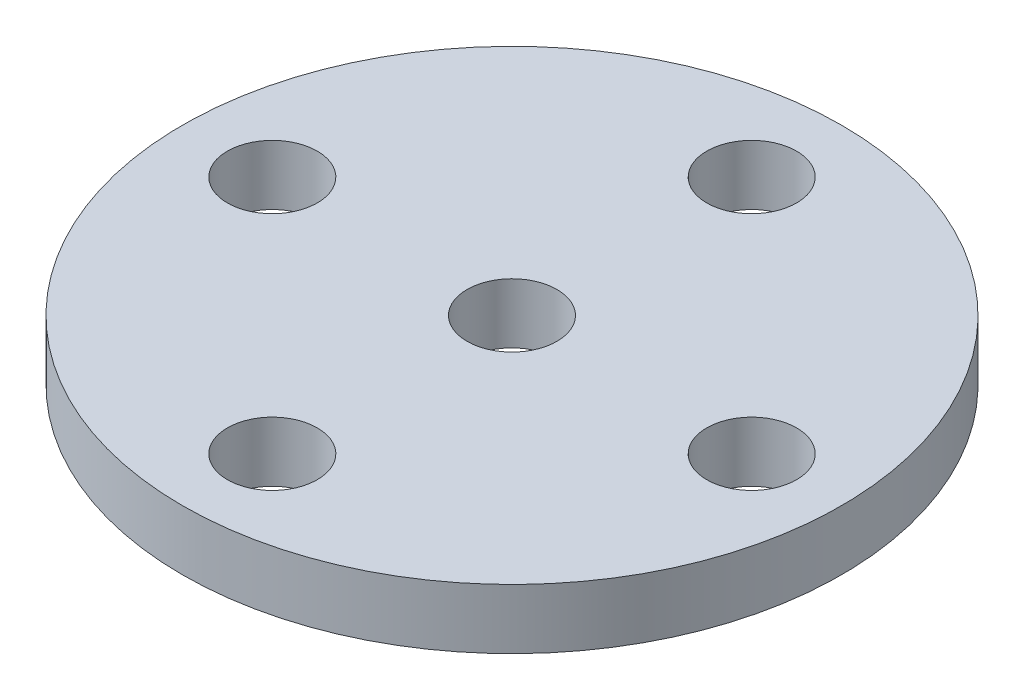
ISO-10303-21;
HEADER;
FILE_DESCRIPTION(('STEP AP214'),'2;1');
FILE_NAME('part.step','',(''),(''),'','','');
FILE_SCHEMA(('AUTOMOTIVE_DESIGN { 1 0 10303 214 1 1 1 1 }'));
ENDSEC;
DATA;
#1=APPLICATION_CONTEXT('core data for automotive mechanical design processes');
#2=APPLICATION_PROTOCOL_DEFINITION('international standard','automotive_design',2000,#1);
#3=PRODUCT_CONTEXT('',#1,'mechanical');
#4=PRODUCT('Part','Part','',(#3));
#5=PRODUCT_RELATED_PRODUCT_CATEGORY('part','',(#4));
#6=PRODUCT_DEFINITION_FORMATION('','',#4);
#7=PRODUCT_DEFINITION_CONTEXT('part definition',#1,'design');
#8=PRODUCT_DEFINITION('design','',#6,#7);
#9=PRODUCT_DEFINITION_SHAPE('','',#8);
#10=(LENGTH_UNIT() NAMED_UNIT(*) SI_UNIT(.MILLI.,.METRE.));
#11=(NAMED_UNIT(*) PLANE_ANGLE_UNIT() SI_UNIT($,.RADIAN.));
#12=(NAMED_UNIT(*) SI_UNIT($,.STERADIAN.) SOLID_ANGLE_UNIT());
#13=UNCERTAINTY_MEASURE_WITH_UNIT(LENGTH_MEASURE(1.E-05),#10,'distance_accuracy_value','');
#14=(GEOMETRIC_REPRESENTATION_CONTEXT(3) GLOBAL_UNCERTAINTY_ASSIGNED_CONTEXT((#13)) GLOBAL_UNIT_ASSIGNED_CONTEXT((#10,
#11,#12)) REPRESENTATION_CONTEXT('',''));
#15=CARTESIAN_POINT('',(0.,0.,0.));
#16=DIRECTION('',(0.,0.,1.));
#17=DIRECTION('',(1.,0.,0.));
#18=AXIS2_PLACEMENT_3D('',#15,#16,#17);
#19=CARTESIAN_POINT('',(0.,2.,0.));
#20=DIRECTION('',(0.,1.,0.));
#21=DIRECTION('',(0.,0.,1.));
#22=AXIS2_PLACEMENT_3D('',#19,#20,#21);
#23=PLANE('',#22);
#24=CARTESIAN_POINT('',(0.,2.,8.));
#25=DIRECTION('',(0.,1.,0.));
#26=DIRECTION('',(0.,0.,-1.));
#27=AXIS2_PLACEMENT_3D('',#24,#25,#26);
#28=CIRCLE('',#27,1.5);
#29=CARTESIAN_POINT('',(0.,2.,6.5));
#30=VERTEX_POINT('',#29);
#31=EDGE_CURVE('E76',#30,#30,#28,.T.);
#32=ORIENTED_EDGE('',*,*,#31,.F.);
#33=EDGE_LOOP('',(#32));
#34=FACE_BOUND('',#33,.T.);
#35=CARTESIAN_POINT('',(8.,2.,0.));
#36=DIRECTION('',(0.,1.,0.));
#37=DIRECTION('',(0.,0.,1.));
#38=AXIS2_PLACEMENT_3D('',#35,#36,#37);
#39=CIRCLE('',#38,1.5);
#40=CARTESIAN_POINT('',(8.,2.,1.5));
#41=VERTEX_POINT('',#40);
#42=EDGE_CURVE('E60',#41,#41,#39,.T.);
#43=ORIENTED_EDGE('',*,*,#42,.F.);
#44=EDGE_LOOP('',(#43));
#45=FACE_BOUND('',#44,.T.);
#46=CARTESIAN_POINT('',(0.,2.,0.));
#47=DIRECTION('',(0.,1.,0.));
#48=DIRECTION('',(0.,0.,1.));
#49=AXIS2_PLACEMENT_3D('',#46,#47,#48);
#50=CIRCLE('',#49,11.);
#51=CARTESIAN_POINT('',(0.,2.,11.));
#52=VERTEX_POINT('',#51);
#53=EDGE_CURVE('E10',#52,#52,#50,.T.);
#54=ORIENTED_EDGE('',*,*,#53,.T.);
#55=EDGE_LOOP('',(#54));
#56=FACE_BOUND('',#55,.T.);
#57=CARTESIAN_POINT('',(0.,2.,-8.));
#58=DIRECTION('',(0.,1.,0.));
#59=DIRECTION('',(0.,0.,1.));
#60=AXIS2_PLACEMENT_3D('',#57,#58,#59);
#61=CIRCLE('',#60,1.5);
#62=CARTESIAN_POINT('',(0.,2.,-6.5));
#63=VERTEX_POINT('',#62);
#64=EDGE_CURVE('E54',#63,#63,#61,.T.);
#65=ORIENTED_EDGE('',*,*,#64,.F.);
#66=EDGE_LOOP('',(#65));
#67=FACE_BOUND('',#66,.T.);
#68=CARTESIAN_POINT('',(-8.,2.,0.));
#69=DIRECTION('',(0.,1.,0.));
#70=DIRECTION('',(0.,0.,-1.));
#71=AXIS2_PLACEMENT_3D('',#68,#69,#70);
#72=CIRCLE('',#71,1.5);
#73=CARTESIAN_POINT('',(-8.,2.,-1.5));
#74=VERTEX_POINT('',#73);
#75=EDGE_CURVE('E68',#74,#74,#72,.T.);
#76=ORIENTED_EDGE('',*,*,#75,.F.);
#77=EDGE_LOOP('',(#76));
#78=FACE_BOUND('',#77,.T.);
#79=CARTESIAN_POINT('',(0.,2.,0.));
#80=DIRECTION('',(0.,1.,0.));
#81=DIRECTION('',(0.,0.,1.));
#82=AXIS2_PLACEMENT_3D('',#79,#80,#81);
#83=CIRCLE('',#82,1.5);
#84=CARTESIAN_POINT('',(0.,2.,1.5));
#85=VERTEX_POINT('',#84);
#86=EDGE_CURVE('E84',#85,#85,#83,.T.);
#87=ORIENTED_EDGE('',*,*,#86,.F.);
#88=EDGE_LOOP('',(#87));
#89=FACE_BOUND('',#88,.T.);
#90=ADVANCED_FACE('F41',(#34,#45,#56,#67,#78,#89),#23,.T.);
#91=CARTESIAN_POINT('',(0.,0.,0.));
#92=DIRECTION('',(0.,1.,0.));
#93=DIRECTION('',(0.,0.,1.));
#94=AXIS2_PLACEMENT_3D('',#91,#92,#93);
#95=PLANE('',#94);
#96=CARTESIAN_POINT('',(0.,0.,0.));
#97=DIRECTION('',(0.,1.,0.));
#98=DIRECTION('',(0.,0.,1.));
#99=AXIS2_PLACEMENT_3D('',#96,#97,#98);
#100=CIRCLE('',#99,11.);
#101=CARTESIAN_POINT('',(0.,0.,11.));
#102=VERTEX_POINT('',#101);
#103=EDGE_CURVE('E45',#102,#102,#100,.T.);
#104=ORIENTED_EDGE('',*,*,#103,.F.);
#105=EDGE_LOOP('',(#104));
#106=FACE_BOUND('',#105,.T.);
#107=CARTESIAN_POINT('',(0.,0.,-8.));
#108=DIRECTION('',(0.,1.,0.));
#109=DIRECTION('',(0.,0.,1.));
#110=AXIS2_PLACEMENT_3D('',#107,#108,#109);
#111=CIRCLE('',#110,1.5);
#112=CARTESIAN_POINT('',(0.,0.,-6.5));
#113=VERTEX_POINT('',#112);
#114=EDGE_CURVE('E56',#113,#113,#111,.T.);
#115=ORIENTED_EDGE('',*,*,#114,.T.);
#116=EDGE_LOOP('',(#115));
#117=FACE_BOUND('',#116,.T.);
#118=CARTESIAN_POINT('',(8.,0.,0.));
#119=DIRECTION('',(0.,1.,0.));
#120=DIRECTION('',(0.,0.,1.));
#121=AXIS2_PLACEMENT_3D('',#118,#119,#120);
#122=CIRCLE('',#121,1.5);
#123=CARTESIAN_POINT('',(8.,0.,1.5));
#124=VERTEX_POINT('',#123);
#125=EDGE_CURVE('E64',#124,#124,#122,.T.);
#126=ORIENTED_EDGE('',*,*,#125,.T.);
#127=EDGE_LOOP('',(#126));
#128=FACE_BOUND('',#127,.T.);
#129=CARTESIAN_POINT('',(-8.,0.,0.));
#130=DIRECTION('',(0.,1.,0.));
#131=DIRECTION('',(0.,0.,-1.));
#132=AXIS2_PLACEMENT_3D('',#129,#130,#131);
#133=CIRCLE('',#132,1.5);
#134=CARTESIAN_POINT('',(-8.,0.,-1.5));
#135=VERTEX_POINT('',#134);
#136=EDGE_CURVE('E72',#135,#135,#133,.T.);
#137=ORIENTED_EDGE('',*,*,#136,.T.);
#138=EDGE_LOOP('',(#137));
#139=FACE_BOUND('',#138,.T.);
#140=CARTESIAN_POINT('',(0.,0.,8.));
#141=DIRECTION('',(0.,1.,0.));
#142=DIRECTION('',(0.,0.,-1.));
#143=AXIS2_PLACEMENT_3D('',#140,#141,#142);
#144=CIRCLE('',#143,1.5);
#145=CARTESIAN_POINT('',(0.,0.,6.5));
#146=VERTEX_POINT('',#145);
#147=EDGE_CURVE('E80',#146,#146,#144,.T.);
#148=ORIENTED_EDGE('',*,*,#147,.T.);
#149=EDGE_LOOP('',(#148));
#150=FACE_BOUND('',#149,.T.);
#151=CARTESIAN_POINT('',(0.,0.,0.));
#152=DIRECTION('',(0.,1.,0.));
#153=DIRECTION('',(0.,0.,1.));
#154=AXIS2_PLACEMENT_3D('',#151,#152,#153);
#155=CIRCLE('',#154,1.5);
#156=CARTESIAN_POINT('',(0.,0.,1.5));
#157=VERTEX_POINT('',#156);
#158=EDGE_CURVE('E88',#157,#157,#155,.T.);
#159=ORIENTED_EDGE('',*,*,#158,.T.);
#160=EDGE_LOOP('',(#159));
#161=FACE_BOUND('',#160,.T.);
#162=ADVANCED_FACE('F100',(#106,#117,#128,#139,#150,#161),#95,.F.);
#163=CARTESIAN_POINT('',(0.,2.,0.));
#164=DIRECTION('',(0.,-1.,0.));
#165=DIRECTION('',(0.,0.,-1.));
#166=AXIS2_PLACEMENT_3D('',#163,#164,#165);
#167=CYLINDRICAL_SURFACE('',#166,11.);
#168=ORIENTED_EDGE('',*,*,#53,.F.);
#169=EDGE_LOOP('',(#168));
#170=FACE_BOUND('',#169,.T.);
#171=ORIENTED_EDGE('',*,*,#103,.T.);
#172=EDGE_LOOP('',(#171));
#173=FACE_BOUND('',#172,.T.);
#174=ADVANCED_FACE('F43',(#170,#173),#167,.T.);
#175=CARTESIAN_POINT('',(0.,2.,-8.));
#176=DIRECTION('',(0.,-1.,0.));
#177=DIRECTION('',(0.,0.,-1.));
#178=AXIS2_PLACEMENT_3D('',#175,#176,#177);
#179=CYLINDRICAL_SURFACE('',#178,1.5);
#180=ORIENTED_EDGE('',*,*,#64,.T.);
#181=EDGE_LOOP('',(#180));
#182=FACE_BOUND('',#181,.T.);
#183=ORIENTED_EDGE('',*,*,#114,.F.);
#184=EDGE_LOOP('',(#183));
#185=FACE_BOUND('',#184,.T.);
#186=ADVANCED_FACE('F110',(#182,#185),#179,.F.);
#187=CARTESIAN_POINT('',(8.,2.,0.));
#188=DIRECTION('',(0.,-1.,0.));
#189=DIRECTION('',(0.,0.,-1.));
#190=AXIS2_PLACEMENT_3D('',#187,#188,#189);
#191=CYLINDRICAL_SURFACE('',#190,1.5);
#192=ORIENTED_EDGE('',*,*,#42,.T.);
#193=EDGE_LOOP('',(#192));
#194=FACE_BOUND('',#193,.T.);
#195=ORIENTED_EDGE('',*,*,#125,.F.);
#196=EDGE_LOOP('',(#195));
#197=FACE_BOUND('',#196,.T.);
#198=ADVANCED_FACE('F113',(#194,#197),#191,.F.);
#199=CARTESIAN_POINT('',(-8.,2.,0.));
#200=DIRECTION('',(0.,-1.,0.));
#201=DIRECTION('',(0.,0.,-1.));
#202=AXIS2_PLACEMENT_3D('',#199,#200,#201);
#203=CYLINDRICAL_SURFACE('',#202,1.5);
#204=ORIENTED_EDGE('',*,*,#75,.T.);
#205=EDGE_LOOP('',(#204));
#206=FACE_BOUND('',#205,.T.);
#207=ORIENTED_EDGE('',*,*,#136,.F.);
#208=EDGE_LOOP('',(#207));
#209=FACE_BOUND('',#208,.T.);
#210=ADVANCED_FACE('F117',(#206,#209),#203,.F.);
#211=CARTESIAN_POINT('',(0.,2.,8.));
#212=DIRECTION('',(0.,-1.,0.));
#213=DIRECTION('',(0.,0.,-1.));
#214=AXIS2_PLACEMENT_3D('',#211,#212,#213);
#215=CYLINDRICAL_SURFACE('',#214,1.5);
#216=ORIENTED_EDGE('',*,*,#31,.T.);
#217=EDGE_LOOP('',(#216));
#218=FACE_BOUND('',#217,.T.);
#219=ORIENTED_EDGE('',*,*,#147,.F.);
#220=EDGE_LOOP('',(#219));
#221=FACE_BOUND('',#220,.T.);
#222=ADVANCED_FACE('F121',(#218,#221),#215,.F.);
#223=CARTESIAN_POINT('',(0.,2.,0.));
#224=DIRECTION('',(0.,-1.,0.));
#225=DIRECTION('',(0.,0.,-1.));
#226=AXIS2_PLACEMENT_3D('',#223,#224,#225);
#227=CYLINDRICAL_SURFACE('',#226,1.5);
#228=ORIENTED_EDGE('',*,*,#86,.T.);
#229=EDGE_LOOP('',(#228));
#230=FACE_BOUND('',#229,.T.);
#231=ORIENTED_EDGE('',*,*,#158,.F.);
#232=EDGE_LOOP('',(#231));
#233=FACE_BOUND('',#232,.T.);
#234=ADVANCED_FACE('F96',(#230,#233),#227,.F.);
#235=CLOSED_SHELL('',(#90,#162,#174,#186,#198,#210,#222,#234));
#236=MANIFOLD_SOLID_BREP('B2',#235);
#237=ADVANCED_BREP_SHAPE_REPRESENTATION('',(#18,#236),#14);
#238=SHAPE_DEFINITION_REPRESENTATION(#9,#237);
ENDSEC;
END-ISO-10303-21;
